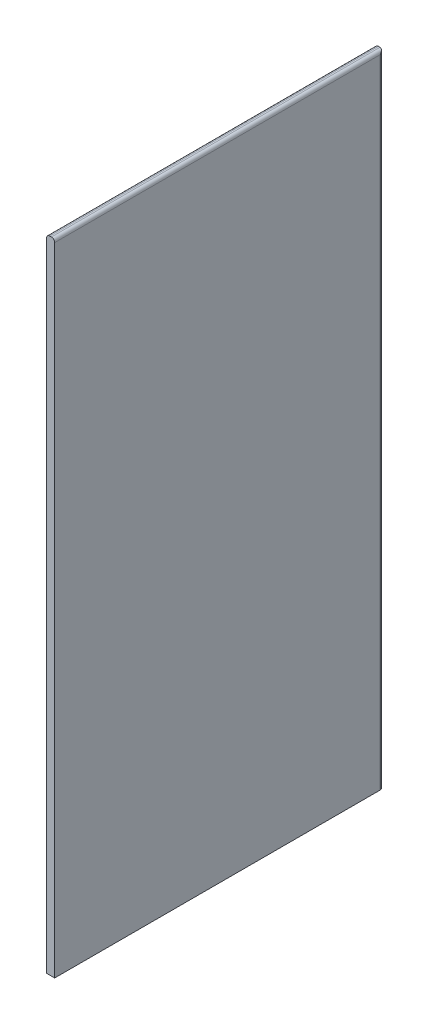
ISO-10303-21;
HEADER;
FILE_DESCRIPTION(('STEP AP214'),'2;1');
FILE_NAME('part.step','',(''),(''),'','','');
FILE_SCHEMA(('AUTOMOTIVE_DESIGN { 1 0 10303 214 1 1 1 1 }'));
ENDSEC;
DATA;
#1=APPLICATION_CONTEXT('core data for automotive mechanical design processes');
#2=APPLICATION_PROTOCOL_DEFINITION('international standard','automotive_design',2000,#1);
#3=PRODUCT_CONTEXT('',#1,'mechanical');
#4=PRODUCT('Part','Part','',(#3));
#5=PRODUCT_RELATED_PRODUCT_CATEGORY('part','',(#4));
#6=PRODUCT_DEFINITION_FORMATION('','',#4);
#7=PRODUCT_DEFINITION_CONTEXT('part definition',#1,'design');
#8=PRODUCT_DEFINITION('design','',#6,#7);
#9=PRODUCT_DEFINITION_SHAPE('','',#8);
#10=(LENGTH_UNIT() NAMED_UNIT(*) SI_UNIT(.MILLI.,.METRE.));
#11=(NAMED_UNIT(*) PLANE_ANGLE_UNIT() SI_UNIT($,.RADIAN.));
#12=(NAMED_UNIT(*) SI_UNIT($,.STERADIAN.) SOLID_ANGLE_UNIT());
#13=UNCERTAINTY_MEASURE_WITH_UNIT(LENGTH_MEASURE(1.E-05),#10,'distance_accuracy_value','');
#14=(GEOMETRIC_REPRESENTATION_CONTEXT(3) GLOBAL_UNCERTAINTY_ASSIGNED_CONTEXT((#13)) GLOBAL_UNIT_ASSIGNED_CONTEXT((#10,
#11,#12)) REPRESENTATION_CONTEXT('',''));
#15=CARTESIAN_POINT('',(0.,0.,0.));
#16=DIRECTION('',(0.,0.,1.));
#17=DIRECTION('',(1.,0.,0.));
#18=AXIS2_PLACEMENT_3D('',#15,#16,#17);
#19=CARTESIAN_POINT('',(227.5,-130.530222179374,-447.66939487209));
#20=DIRECTION('',(1.,0.,0.));
#21=DIRECTION('',(0.,1.,0.));
#22=AXIS2_PLACEMENT_3D('',#19,#20,#21);
#23=PLANE('',#22);
#24=DIRECTION('',(0.,1.,0.));
#25=VECTOR('',#24,1.);
#26=CARTESIAN_POINT('',(227.5,-130.530222179374,-442.99942660475));
#27=LINE('',#26,#25);
#28=CARTESIAN_POINT('',(227.5,75.,-442.99942660475));
#29=VERTEX_POINT('',#28);
#30=CARTESIAN_POINT('',(227.5,468.,-442.999426604751));
#31=VERTEX_POINT('',#30);
#32=EDGE_CURVE('E140',#29,#31,#27,.T.);
#33=ORIENTED_EDGE('',*,*,#32,.T.);
#34=DIRECTION('',(0.,0.,-1.));
#35=VECTOR('',#34,1.);
#36=CARTESIAN_POINT('',(227.5,468.,-447.669394872091));
#37=LINE('',#36,#35);
#38=CARTESIAN_POINT('',(227.5,468.,-242.2));
#39=VERTEX_POINT('',#38);
#40=EDGE_CURVE('E142',#31,#39,#37,.F.);
#41=ORIENTED_EDGE('',*,*,#40,.T.);
#42=DIRECTION('',(0.,1.,0.));
#43=VECTOR('',#42,1.);
#44=CARTESIAN_POINT('',(227.5,-130.530222179374,-242.2));
#45=LINE('',#44,#43);
#46=CARTESIAN_POINT('',(227.5,75.,-242.2));
#47=VERTEX_POINT('',#46);
#48=EDGE_CURVE('E115',#47,#39,#45,.T.);
#49=ORIENTED_EDGE('',*,*,#48,.F.);
#50=DIRECTION('',(0.,0.,1.));
#51=VECTOR('',#50,1.);
#52=CARTESIAN_POINT('',(227.5,75.,-447.66939487209));
#53=LINE('',#52,#51);
#54=EDGE_CURVE('E107',#29,#47,#53,.T.);
#55=ORIENTED_EDGE('',*,*,#54,.F.);
#56=EDGE_LOOP('',(#33,#41,#49,#55));
#57=FACE_BOUND('',#56,.T.);
#58=ADVANCED_FACE('F38',(#57),#23,.T.);
#59=CARTESIAN_POINT('',(222.5,-130.530222179374,-447.66939487209));
#60=DIRECTION('',(-1.,0.,0.));
#61=DIRECTION('',(0.,-1.,0.));
#62=AXIS2_PLACEMENT_3D('',#59,#60,#61);
#63=PLANE('',#62);
#64=DIRECTION('',(0.,1.,0.));
#65=VECTOR('',#64,1.);
#66=CARTESIAN_POINT('',(222.5,-130.530222179374,-242.2));
#67=LINE('',#66,#65);
#68=CARTESIAN_POINT('',(222.5,75.,-242.2));
#69=VERTEX_POINT('',#68);
#70=CARTESIAN_POINT('',(222.5,468.,-242.2));
#71=VERTEX_POINT('',#70);
#72=EDGE_CURVE('E114',#69,#71,#67,.T.);
#73=ORIENTED_EDGE('',*,*,#72,.T.);
#74=DIRECTION('',(0.,0.,1.));
#75=VECTOR('',#74,1.);
#76=CARTESIAN_POINT('',(222.5,468.,-447.669394872091));
#77=LINE('',#76,#75);
#78=CARTESIAN_POINT('',(222.5,468.,-442.999426604751));
#79=VERTEX_POINT('',#78);
#80=EDGE_CURVE('E11',#71,#79,#77,.F.);
#81=ORIENTED_EDGE('',*,*,#80,.T.);
#82=DIRECTION('',(0.,1.,0.));
#83=VECTOR('',#82,1.);
#84=CARTESIAN_POINT('',(222.5,-130.530222179374,-442.99942660475));
#85=LINE('',#84,#83);
#86=CARTESIAN_POINT('',(222.5,75.,-442.999426604751));
#87=VERTEX_POINT('',#86);
#88=EDGE_CURVE('E47',#79,#87,#85,.F.);
#89=ORIENTED_EDGE('',*,*,#88,.T.);
#90=DIRECTION('',(0.,0.,-1.));
#91=VECTOR('',#90,1.);
#92=CARTESIAN_POINT('',(222.5,75.,-447.66939487209));
#93=LINE('',#92,#91);
#94=EDGE_CURVE('E104',#69,#87,#93,.T.);
#95=ORIENTED_EDGE('',*,*,#94,.F.);
#96=EDGE_LOOP('',(#73,#81,#89,#95));
#97=FACE_BOUND('',#96,.T.);
#98=ADVANCED_FACE('F113',(#97),#63,.T.);
#99=CARTESIAN_POINT('',(0.,470.,-1.11022302462516E-13));
#100=DIRECTION('',(0.,1.,0.));
#101=DIRECTION('',(0.,0.,1.));
#102=AXIS2_PLACEMENT_3D('',#99,#100,#101);
#103=PLANE('',#102);
#104=DIRECTION('',(1.,0.,0.));
#105=VECTOR('',#104,1.);
#106=CARTESIAN_POINT('',(222.5,470.,-242.2));
#107=LINE('',#106,#105);
#108=CARTESIAN_POINT('',(224.5,470.,-242.2));
#109=VERTEX_POINT('',#108);
#110=CARTESIAN_POINT('',(225.5,470.,-242.2));
#111=VERTEX_POINT('',#110);
#112=EDGE_CURVE('E120',#109,#111,#107,.T.);
#113=ORIENTED_EDGE('',*,*,#112,.T.);
#114=DIRECTION('',(0.,0.,-1.));
#115=VECTOR('',#114,1.);
#116=CARTESIAN_POINT('',(225.5,470.,-1.66533453693773E-13));
#117=LINE('',#116,#115);
#118=CARTESIAN_POINT('',(225.5,470.,-444.999431817448));
#119=VERTEX_POINT('',#118);
#120=EDGE_CURVE('E133',#111,#119,#117,.T.);
#121=ORIENTED_EDGE('',*,*,#120,.T.);
#122=CARTESIAN_POINT('',(225.,470.,-225.));
#123=DIRECTION('',(0.,1.,0.));
#124=DIRECTION('',(-1.,0.,0.));
#125=AXIS2_PLACEMENT_3D('',#122,#123,#124);
#126=CIRCLE('',#125,220.);
#127=CARTESIAN_POINT('',(224.5,470.,-444.999431817448));
#128=VERTEX_POINT('',#127);
#129=EDGE_CURVE('E158',#119,#128,#126,.T.);
#130=ORIENTED_EDGE('',*,*,#129,.T.);
#131=DIRECTION('',(0.,0.,1.));
#132=VECTOR('',#131,1.);
#133=CARTESIAN_POINT('',(224.5,470.,-1.66533453693773E-13));
#134=LINE('',#133,#132);
#135=EDGE_CURVE('E130',#128,#109,#134,.T.);
#136=ORIENTED_EDGE('',*,*,#135,.T.);
#137=EDGE_LOOP('',(#113,#121,#130,#136));
#138=FACE_BOUND('',#137,.T.);
#139=ADVANCED_FACE('F182',(#138),#103,.T.);
#140=CARTESIAN_POINT('',(225.,75.,-225.));
#141=DIRECTION('',(0.,1.,0.));
#142=DIRECTION('',(-1.,0.,0.));
#143=AXIS2_PLACEMENT_3D('',#140,#141,#142);
#144=PLANE('',#143);
#145=CARTESIAN_POINT('',(225.,75.,-225.));
#146=DIRECTION('',(0.,1.,0.));
#147=DIRECTION('',(-1.,0.,0.));
#148=AXIS2_PLACEMENT_3D('',#145,#146,#147);
#149=CIRCLE('',#148,220.);
#150=CARTESIAN_POINT('',(225.504587155963,74.9999999999999,-444.999421344244));
#151=VERTEX_POINT('',#150);
#152=CARTESIAN_POINT('',(224.495412844037,74.9999999999999,-444.999421344244));
#153=VERTEX_POINT('',#152);
#154=EDGE_CURVE('E127',#151,#153,#149,.T.);
#155=ORIENTED_EDGE('',*,*,#154,.F.);
#156=CARTESIAN_POINT('',(225.5,75.,-442.999426604751));
#157=DIRECTION('',(0.,1.,0.));
#158=DIRECTION('',(-1.,0.,0.));
#159=AXIS2_PLACEMENT_3D('',#156,#157,#158);
#160=CIRCLE('',#159,2.);
#161=EDGE_CURVE('E149',#151,#29,#160,.F.);
#162=ORIENTED_EDGE('',*,*,#161,.T.);
#163=ORIENTED_EDGE('',*,*,#54,.T.);
#164=DIRECTION('',(-1.,0.,0.));
#165=VECTOR('',#164,1.);
#166=CARTESIAN_POINT('',(222.5,75.,-242.2));
#167=LINE('',#166,#165);
#168=EDGE_CURVE('E101',#47,#69,#167,.T.);
#169=ORIENTED_EDGE('',*,*,#168,.T.);
#170=ORIENTED_EDGE('',*,*,#94,.T.);
#171=CARTESIAN_POINT('',(224.5,75.,-442.999426604751));
#172=DIRECTION('',(0.,1.,0.));
#173=DIRECTION('',(-1.,0.,0.));
#174=AXIS2_PLACEMENT_3D('',#171,#172,#173);
#175=CIRCLE('',#174,2.);
#176=EDGE_CURVE('E147',#87,#153,#175,.F.);
#177=ORIENTED_EDGE('',*,*,#176,.T.);
#178=EDGE_LOOP('',(#155,#162,#163,#169,#170,#177));
#179=FACE_BOUND('',#178,.T.);
#180=ADVANCED_FACE('F103',(#179),#144,.F.);
#181=CARTESIAN_POINT('',(222.5,-130.530222179374,-242.2));
#182=DIRECTION('',(0.,0.,1.));
#183=DIRECTION('',(0.,-1.,0.));
#184=AXIS2_PLACEMENT_3D('',#181,#182,#183);
#185=PLANE('',#184);
#186=ORIENTED_EDGE('',*,*,#48,.T.);
#187=CARTESIAN_POINT('',(225.5,468.,-242.2));
#188=DIRECTION('',(0.,0.,1.));
#189=DIRECTION('',(0.,-1.,0.));
#190=AXIS2_PLACEMENT_3D('',#187,#188,#189);
#191=CIRCLE('',#190,2.);
#192=EDGE_CURVE('E145',#39,#111,#191,.T.);
#193=ORIENTED_EDGE('',*,*,#192,.T.);
#194=ORIENTED_EDGE('',*,*,#112,.F.);
#195=CARTESIAN_POINT('',(224.5,468.,-242.2));
#196=DIRECTION('',(0.,0.,1.));
#197=DIRECTION('',(0.,-1.,0.));
#198=AXIS2_PLACEMENT_3D('',#195,#196,#197);
#199=CIRCLE('',#198,2.);
#200=EDGE_CURVE('E119',#109,#71,#199,.T.);
#201=ORIENTED_EDGE('',*,*,#200,.T.);
#202=ORIENTED_EDGE('',*,*,#72,.F.);
#203=ORIENTED_EDGE('',*,*,#168,.F.);
#204=EDGE_LOOP('',(#186,#193,#194,#201,#202,#203));
#205=FACE_BOUND('',#204,.T.);
#206=ADVANCED_FACE('F117',(#205),#185,.T.);
#207=CARTESIAN_POINT('',(225.,-606.32717805851,-225.));
#208=DIRECTION('',(0.,1.,0.));
#209=DIRECTION('',(-1.,0.,0.));
#210=AXIS2_PLACEMENT_3D('',#207,#208,#209);
#211=CYLINDRICAL_SURFACE('',#210,220.);
#212=CARTESIAN_POINT('',(225.504587155963,470.,-444.999421344244));
#213=VERTEX_POINT('',#212);
#214=EDGE_CURVE('E124',#213,#119,#126,.T.);
#215=ORIENTED_EDGE('',*,*,#214,.F.);
#216=DIRECTION('',(0.,1.,0.));
#217=VECTOR('',#216,1.);
#218=CARTESIAN_POINT('',(225.504587155963,-606.32717805851,-444.999421344244));
#219=LINE('',#218,#217);
#220=EDGE_CURVE('E138',#213,#151,#219,.F.);
#221=ORIENTED_EDGE('',*,*,#220,.T.);
#222=ORIENTED_EDGE('',*,*,#154,.T.);
#223=DIRECTION('',(0.,1.,0.));
#224=VECTOR('',#223,1.);
#225=CARTESIAN_POINT('',(224.495412844037,-606.32717805851,-444.999421344244));
#226=LINE('',#225,#224);
#227=CARTESIAN_POINT('',(224.495412844037,470.,-444.999421344244));
#228=VERTEX_POINT('',#227);
#229=EDGE_CURVE('E136',#153,#228,#226,.T.);
#230=ORIENTED_EDGE('',*,*,#229,.T.);
#231=EDGE_CURVE('E153',#128,#228,#126,.T.);
#232=ORIENTED_EDGE('',*,*,#231,.F.);
#233=ORIENTED_EDGE('',*,*,#129,.F.);
#234=EDGE_LOOP('',(#215,#221,#222,#230,#232,#233));
#235=FACE_BOUND('',#234,.T.);
#236=ADVANCED_FACE('F169',(#235),#211,.T.);
#237=CARTESIAN_POINT('',(225.5,-606.32717805851,-442.99942660475));
#238=DIRECTION('',(0.,1.,0.));
#239=DIRECTION('',(-1.,0.,0.));
#240=AXIS2_PLACEMENT_3D('',#237,#238,#239);
#241=CYLINDRICAL_SURFACE('',#240,2.);
#242=ORIENTED_EDGE('',*,*,#161,.F.);
#243=ORIENTED_EDGE('',*,*,#220,.F.);
#244=CARTESIAN_POINT('',(225.5,468.,-442.999426604751));
#245=DIRECTION('',(0.,0.707106781186548,0.707106781186547));
#246=DIRECTION('',(0.,0.707106781186547,-0.707106781186548));
#247=AXIS2_PLACEMENT_3D('',#244,#245,#246);
#248=ELLIPSE('',#247,2.82842712474619,2.);
#249=EDGE_CURVE('E151',#31,#213,#248,.T.);
#250=ORIENTED_EDGE('',*,*,#249,.F.);
#251=ORIENTED_EDGE('',*,*,#32,.F.);
#252=EDGE_LOOP('',(#242,#243,#250,#251));
#253=FACE_BOUND('',#252,.T.);
#254=ADVANCED_FACE('F173',(#253),#241,.T.);
#255=CARTESIAN_POINT('',(225.5,468.,-1.66533453693773E-13));
#256=DIRECTION('',(0.,0.,-1.));
#257=DIRECTION('',(0.,1.,0.));
#258=AXIS2_PLACEMENT_3D('',#255,#256,#257);
#259=CYLINDRICAL_SURFACE('',#258,2.);
#260=ORIENTED_EDGE('',*,*,#192,.F.);
#261=ORIENTED_EDGE('',*,*,#40,.F.);
#262=ORIENTED_EDGE('',*,*,#249,.T.);
#263=ORIENTED_EDGE('',*,*,#214,.T.);
#264=ORIENTED_EDGE('',*,*,#120,.F.);
#265=EDGE_LOOP('',(#260,#261,#262,#263,#264));
#266=FACE_BOUND('',#265,.T.);
#267=ADVANCED_FACE('F179',(#266),#259,.T.);
#268=CARTESIAN_POINT('',(224.5,-606.32717805851,-442.99942660475));
#269=DIRECTION('',(0.,1.,0.));
#270=DIRECTION('',(-1.,0.,0.));
#271=AXIS2_PLACEMENT_3D('',#268,#269,#270);
#272=CYLINDRICAL_SURFACE('',#271,2.);
#273=ORIENTED_EDGE('',*,*,#176,.F.);
#274=ORIENTED_EDGE('',*,*,#88,.F.);
#275=CARTESIAN_POINT('',(224.5,468.,-442.999426604751));
#276=DIRECTION('',(0.,0.707106781186548,0.707106781186547));
#277=DIRECTION('',(0.,0.707106781186547,-0.707106781186548));
#278=AXIS2_PLACEMENT_3D('',#275,#276,#277);
#279=ELLIPSE('',#278,2.82842712474619,2.);
#280=EDGE_CURVE('E42',#228,#79,#279,.T.);
#281=ORIENTED_EDGE('',*,*,#280,.F.);
#282=ORIENTED_EDGE('',*,*,#229,.F.);
#283=EDGE_LOOP('',(#273,#274,#281,#282));
#284=FACE_BOUND('',#283,.T.);
#285=ADVANCED_FACE('F40',(#284),#272,.T.);
#286=CARTESIAN_POINT('',(224.5,468.,-1.66533453693773E-13));
#287=DIRECTION('',(0.,0.,1.));
#288=DIRECTION('',(0.,-1.,0.));
#289=AXIS2_PLACEMENT_3D('',#286,#287,#288);
#290=CYLINDRICAL_SURFACE('',#289,2.);
#291=ORIENTED_EDGE('',*,*,#280,.T.);
#292=ORIENTED_EDGE('',*,*,#80,.F.);
#293=ORIENTED_EDGE('',*,*,#200,.F.);
#294=ORIENTED_EDGE('',*,*,#135,.F.);
#295=ORIENTED_EDGE('',*,*,#231,.T.);
#296=EDGE_LOOP('',(#291,#292,#293,#294,#295));
#297=FACE_BOUND('',#296,.T.);
#298=ADVANCED_FACE('F163',(#297),#290,.T.);
#299=CLOSED_SHELL('',(#58,#98,#139,#180,#206,#236,#254,#267,#285,#298));
#300=MANIFOLD_SOLID_BREP('B2',#299);
#301=ADVANCED_BREP_SHAPE_REPRESENTATION('',(#18,#300),#14);
#302=SHAPE_DEFINITION_REPRESENTATION(#9,#301);
ENDSEC;
END-ISO-10303-21;
